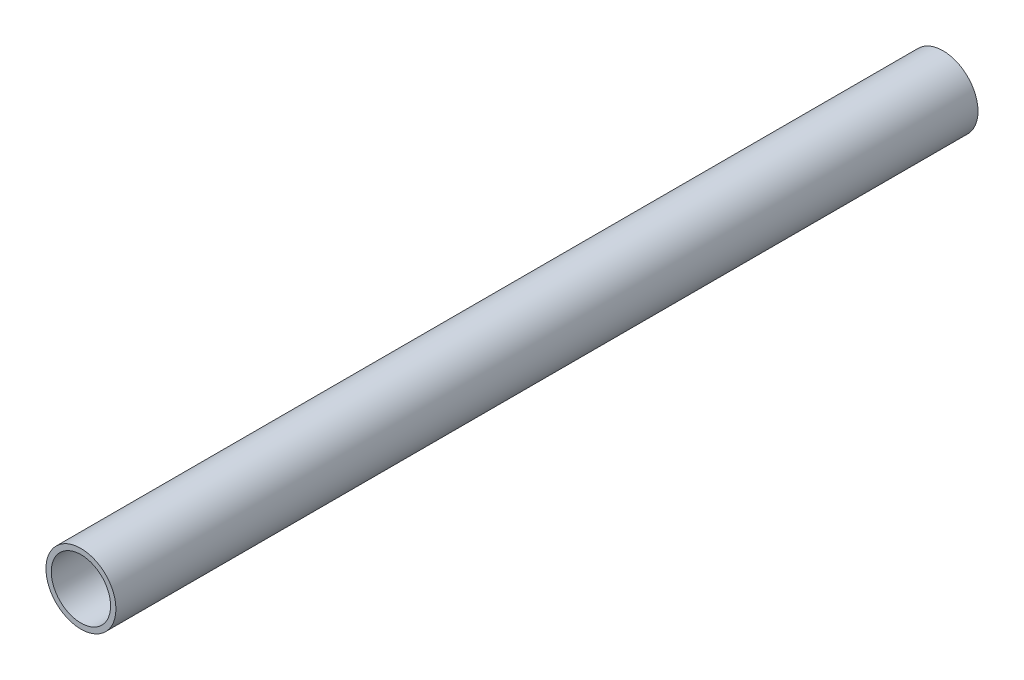
ISO-10303-21;
HEADER;
FILE_DESCRIPTION(('STEP AP214'),'2;1');
FILE_NAME('part.step','',(''),(''),'','','');
FILE_SCHEMA(('AUTOMOTIVE_DESIGN { 1 0 10303 214 1 1 1 1 }'));
ENDSEC;
DATA;
#1=APPLICATION_CONTEXT('core data for automotive mechanical design processes');
#2=APPLICATION_PROTOCOL_DEFINITION('international standard','automotive_design',2000,#1);
#3=PRODUCT_CONTEXT('',#1,'mechanical');
#4=PRODUCT('Part','Part','',(#3));
#5=PRODUCT_RELATED_PRODUCT_CATEGORY('part','',(#4));
#6=PRODUCT_DEFINITION_FORMATION('','',#4);
#7=PRODUCT_DEFINITION_CONTEXT('part definition',#1,'design');
#8=PRODUCT_DEFINITION('design','',#6,#7);
#9=PRODUCT_DEFINITION_SHAPE('','',#8);
#10=(LENGTH_UNIT() NAMED_UNIT(*) SI_UNIT(.MILLI.,.METRE.));
#11=(NAMED_UNIT(*) PLANE_ANGLE_UNIT() SI_UNIT($,.RADIAN.));
#12=(NAMED_UNIT(*) SI_UNIT($,.STERADIAN.) SOLID_ANGLE_UNIT());
#13=UNCERTAINTY_MEASURE_WITH_UNIT(LENGTH_MEASURE(1.E-05),#10,'distance_accuracy_value','');
#14=(GEOMETRIC_REPRESENTATION_CONTEXT(3) GLOBAL_UNCERTAINTY_ASSIGNED_CONTEXT((#13)) GLOBAL_UNIT_ASSIGNED_CONTEXT((#10,
#11,#12)) REPRESENTATION_CONTEXT('',''));
#15=CARTESIAN_POINT('',(0.,0.,0.));
#16=DIRECTION('',(0.,0.,1.));
#17=DIRECTION('',(1.,0.,0.));
#18=AXIS2_PLACEMENT_3D('',#15,#16,#17);
#19=CARTESIAN_POINT('',(0.,0.,170.));
#20=DIRECTION('',(0.,0.,1.));
#21=DIRECTION('',(1.,0.,0.));
#22=AXIS2_PLACEMENT_3D('',#19,#20,#21);
#23=PLANE('',#22);
#24=CARTESIAN_POINT('',(0.,0.,170.));
#25=DIRECTION('',(0.,0.,1.));
#26=DIRECTION('',(1.,0.,0.));
#27=AXIS2_PLACEMENT_3D('',#24,#25,#26);
#28=CIRCLE('',#27,6.9);
#29=CARTESIAN_POINT('',(6.9,0.,170.));
#30=VERTEX_POINT('',#29);
#31=EDGE_CURVE('E10',#30,#30,#28,.T.);
#32=ORIENTED_EDGE('',*,*,#31,.T.);
#33=EDGE_LOOP('',(#32));
#34=FACE_BOUND('',#33,.T.);
#35=CARTESIAN_POINT('',(0.,0.,170.));
#36=DIRECTION('',(0.,0.,1.));
#37=DIRECTION('',(1.,0.,0.));
#38=AXIS2_PLACEMENT_3D('',#35,#36,#37);
#39=CIRCLE('',#38,5.85);
#40=CARTESIAN_POINT('',(5.85,0.,170.));
#41=VERTEX_POINT('',#40);
#42=EDGE_CURVE('E41',#41,#41,#39,.T.);
#43=ORIENTED_EDGE('',*,*,#42,.F.);
#44=EDGE_LOOP('',(#43));
#45=FACE_BOUND('',#44,.T.);
#46=ADVANCED_FACE('F30',(#34,#45),#23,.T.);
#47=CARTESIAN_POINT('',(0.,0.,0.));
#48=DIRECTION('',(0.,0.,1.));
#49=DIRECTION('',(1.,0.,0.));
#50=AXIS2_PLACEMENT_3D('',#47,#48,#49);
#51=PLANE('',#50);
#52=CARTESIAN_POINT('',(0.,0.,0.));
#53=DIRECTION('',(0.,0.,1.));
#54=DIRECTION('',(1.,0.,0.));
#55=AXIS2_PLACEMENT_3D('',#52,#53,#54);
#56=CIRCLE('',#55,6.9);
#57=CARTESIAN_POINT('',(6.9,0.,0.));
#58=VERTEX_POINT('',#57);
#59=EDGE_CURVE('E34',#58,#58,#56,.T.);
#60=ORIENTED_EDGE('',*,*,#59,.F.);
#61=EDGE_LOOP('',(#60));
#62=FACE_BOUND('',#61,.T.);
#63=CARTESIAN_POINT('',(0.,0.,0.));
#64=DIRECTION('',(0.,0.,1.));
#65=DIRECTION('',(1.,0.,0.));
#66=AXIS2_PLACEMENT_3D('',#63,#64,#65);
#67=CIRCLE('',#66,5.85);
#68=CARTESIAN_POINT('',(5.85,0.,0.));
#69=VERTEX_POINT('',#68);
#70=EDGE_CURVE('E43',#69,#69,#67,.T.);
#71=ORIENTED_EDGE('',*,*,#70,.T.);
#72=EDGE_LOOP('',(#71));
#73=FACE_BOUND('',#72,.T.);
#74=ADVANCED_FACE('F53',(#62,#73),#51,.F.);
#75=CARTESIAN_POINT('',(0.,0.,170.));
#76=DIRECTION('',(0.,0.,-1.));
#77=DIRECTION('',(-1.,0.,0.));
#78=AXIS2_PLACEMENT_3D('',#75,#76,#77);
#79=CYLINDRICAL_SURFACE('',#78,6.9);
#80=ORIENTED_EDGE('',*,*,#31,.F.);
#81=EDGE_LOOP('',(#80));
#82=FACE_BOUND('',#81,.T.);
#83=ORIENTED_EDGE('',*,*,#59,.T.);
#84=EDGE_LOOP('',(#83));
#85=FACE_BOUND('',#84,.T.);
#86=ADVANCED_FACE('F32',(#82,#85),#79,.T.);
#87=CARTESIAN_POINT('',(0.,0.,170.));
#88=DIRECTION('',(0.,0.,-1.));
#89=DIRECTION('',(-1.,0.,0.));
#90=AXIS2_PLACEMENT_3D('',#87,#88,#89);
#91=CYLINDRICAL_SURFACE('',#90,5.85);
#92=ORIENTED_EDGE('',*,*,#42,.T.);
#93=EDGE_LOOP('',(#92));
#94=FACE_BOUND('',#93,.T.);
#95=ORIENTED_EDGE('',*,*,#70,.F.);
#96=EDGE_LOOP('',(#95));
#97=FACE_BOUND('',#96,.T.);
#98=ADVANCED_FACE('F49',(#94,#97),#91,.F.);
#99=CLOSED_SHELL('',(#46,#74,#86,#98));
#100=MANIFOLD_SOLID_BREP('B2',#99);
#101=ADVANCED_BREP_SHAPE_REPRESENTATION('',(#18,#100),#14);
#102=SHAPE_DEFINITION_REPRESENTATION(#9,#101);
ENDSEC;
END-ISO-10303-21;
